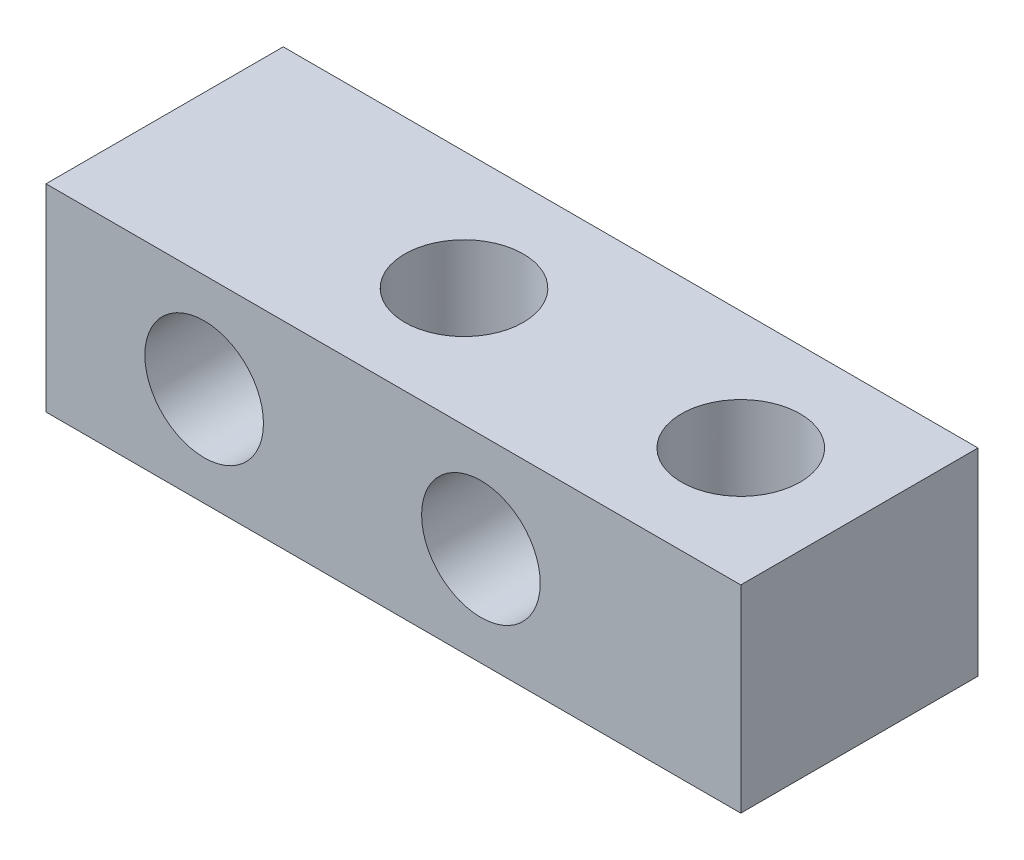
ISO-10303-21;
HEADER;
FILE_DESCRIPTION(('STEP AP214'),'2;1');
FILE_NAME('part.step','',(''),(''),'','','');
FILE_SCHEMA(('AUTOMOTIVE_DESIGN { 1 0 10303 214 1 1 1 1 }'));
ENDSEC;
DATA;
#1=APPLICATION_CONTEXT('core data for automotive mechanical design processes');
#2=APPLICATION_PROTOCOL_DEFINITION('international standard','automotive_design',2000,#1);
#3=PRODUCT_CONTEXT('',#1,'mechanical');
#4=PRODUCT('Part','Part','',(#3));
#5=PRODUCT_RELATED_PRODUCT_CATEGORY('part','',(#4));
#6=PRODUCT_DEFINITION_FORMATION('','',#4);
#7=PRODUCT_DEFINITION_CONTEXT('part definition',#1,'design');
#8=PRODUCT_DEFINITION('design','',#6,#7);
#9=PRODUCT_DEFINITION_SHAPE('','',#8);
#10=(LENGTH_UNIT() NAMED_UNIT(*) SI_UNIT(.MILLI.,.METRE.));
#11=(NAMED_UNIT(*) PLANE_ANGLE_UNIT() SI_UNIT($,.RADIAN.));
#12=(NAMED_UNIT(*) SI_UNIT($,.STERADIAN.) SOLID_ANGLE_UNIT());
#13=UNCERTAINTY_MEASURE_WITH_UNIT(LENGTH_MEASURE(1.E-05),#10,'distance_accuracy_value','');
#14=(GEOMETRIC_REPRESENTATION_CONTEXT(3) GLOBAL_UNCERTAINTY_ASSIGNED_CONTEXT((#13)) GLOBAL_UNIT_ASSIGNED_CONTEXT((#10,
#11,#12)) REPRESENTATION_CONTEXT('',''));
#15=CARTESIAN_POINT('',(0.,0.,0.));
#16=DIRECTION('',(0.,0.,1.));
#17=DIRECTION('',(1.,0.,0.));
#18=AXIS2_PLACEMENT_3D('',#15,#16,#17);
#19=CARTESIAN_POINT('',(-48.5441558772987,4.45000000005311,6.));
#20=DIRECTION('',(0.,-1.,0.));
#21=DIRECTION('',(0.,0.,-1.));
#22=AXIS2_PLACEMENT_3D('',#19,#20,#21);
#23=PLANE('',#22);
#24=CARTESIAN_POINT('',(-40.9713456484612,4.45000000005311,3.));
#25=DIRECTION('',(0.,-1.,0.));
#26=DIRECTION('',(1.,0.,0.));
#27=AXIS2_PLACEMENT_3D('',#24,#25,#26);
#28=CIRCLE('',#27,1.5);
#29=CARTESIAN_POINT('',(-39.4713456484612,4.45000000005311,3.));
#30=VERTEX_POINT('',#29);
#31=EDGE_CURVE('E117',#30,#30,#28,.T.);
#32=ORIENTED_EDGE('',*,*,#31,.T.);
#33=EDGE_LOOP('',(#32));
#34=FACE_BOUND('',#33,.T.);
#35=CARTESIAN_POINT('',(-33.9713456484612,4.45000000005311,3.));
#36=DIRECTION('',(0.,-1.,0.));
#37=DIRECTION('',(1.,0.,0.));
#38=AXIS2_PLACEMENT_3D('',#35,#36,#37);
#39=CIRCLE('',#38,1.5);
#40=CARTESIAN_POINT('',(-32.4713456484612,4.45000000005311,3.));
#41=VERTEX_POINT('',#40);
#42=EDGE_CURVE('E123',#41,#41,#39,.T.);
#43=ORIENTED_EDGE('',*,*,#42,.T.);
#44=EDGE_LOOP('',(#43));
#45=FACE_BOUND('',#44,.T.);
#46=DIRECTION('',(-1.,0.,0.));
#47=VECTOR('',#46,1.);
#48=CARTESIAN_POINT('',(-48.5441558772987,4.45000000005311,0.));
#49=LINE('',#48,#47);
#50=CARTESIAN_POINT('',(-30.9713456484612,4.45000000005311,0.));
#51=VERTEX_POINT('',#50);
#52=CARTESIAN_POINT('',(-48.5441558772987,4.45000000005311,0.));
#53=VERTEX_POINT('',#52);
#54=EDGE_CURVE('E107',#51,#53,#49,.T.);
#55=ORIENTED_EDGE('',*,*,#54,.T.);
#56=DIRECTION('',(0.,0.,-1.));
#57=VECTOR('',#56,1.);
#58=CARTESIAN_POINT('',(-48.5441558772987,4.45000000005311,6.));
#59=LINE('',#58,#57);
#60=CARTESIAN_POINT('',(-48.5441558772987,4.45000000005311,6.));
#61=VERTEX_POINT('',#60);
#62=EDGE_CURVE('E11',#61,#53,#59,.T.);
#63=ORIENTED_EDGE('',*,*,#62,.F.);
#64=DIRECTION('',(-1.,0.,0.));
#65=VECTOR('',#64,1.);
#66=CARTESIAN_POINT('',(-48.5441558772987,4.45000000005311,6.));
#67=LINE('',#66,#65);
#68=CARTESIAN_POINT('',(-30.9713456484612,4.45000000005311,6.));
#69=VERTEX_POINT('',#68);
#70=EDGE_CURVE('E94',#69,#61,#67,.T.);
#71=ORIENTED_EDGE('',*,*,#70,.F.);
#72=DIRECTION('',(0.,0.,-1.));
#73=VECTOR('',#72,1.);
#74=CARTESIAN_POINT('',(-30.9713456484612,4.45000000005311,6.));
#75=LINE('',#74,#73);
#76=EDGE_CURVE('E103',#69,#51,#75,.T.);
#77=ORIENTED_EDGE('',*,*,#76,.T.);
#78=EDGE_LOOP('',(#55,#63,#71,#77));
#79=FACE_BOUND('',#78,.T.);
#80=ADVANCED_FACE('F41',(#34,#45,#79),#23,.F.);
#81=CARTESIAN_POINT('',(-48.5441558772987,-0.549999999946895,6.));
#82=DIRECTION('',(1.,0.,0.));
#83=DIRECTION('',(0.,0.,-1.));
#84=AXIS2_PLACEMENT_3D('',#81,#82,#83);
#85=PLANE('',#84);
#86=DIRECTION('',(0.,-1.,0.));
#87=VECTOR('',#86,1.);
#88=CARTESIAN_POINT('',(-48.5441558772987,-0.549999999946895,0.));
#89=LINE('',#88,#87);
#90=CARTESIAN_POINT('',(-48.5441558772987,-0.549999999946895,0.));
#91=VERTEX_POINT('',#90);
#92=EDGE_CURVE('E98',#53,#91,#89,.T.);
#93=ORIENTED_EDGE('',*,*,#92,.T.);
#94=DIRECTION('',(0.,0.,-1.));
#95=VECTOR('',#94,1.);
#96=CARTESIAN_POINT('',(-48.5441558772987,-0.549999999946895,6.));
#97=LINE('',#96,#95);
#98=CARTESIAN_POINT('',(-48.5441558772987,-0.549999999946895,6.));
#99=VERTEX_POINT('',#98);
#100=EDGE_CURVE('E50',#99,#91,#97,.T.);
#101=ORIENTED_EDGE('',*,*,#100,.F.);
#102=DIRECTION('',(0.,-1.,0.));
#103=VECTOR('',#102,1.);
#104=CARTESIAN_POINT('',(-48.5441558772987,-0.549999999946895,6.));
#105=LINE('',#104,#103);
#106=EDGE_CURVE('E89',#61,#99,#105,.T.);
#107=ORIENTED_EDGE('',*,*,#106,.F.);
#108=ORIENTED_EDGE('',*,*,#62,.T.);
#109=EDGE_LOOP('',(#93,#101,#107,#108));
#110=FACE_BOUND('',#109,.T.);
#111=ADVANCED_FACE('F97',(#110),#85,.F.);
#112=CARTESIAN_POINT('',(-30.9713456484612,-0.549999999946893,6.));
#113=DIRECTION('',(0.,1.,0.));
#114=DIRECTION('',(-1.,0.,0.));
#115=AXIS2_PLACEMENT_3D('',#112,#113,#114);
#116=PLANE('',#115);
#117=CARTESIAN_POINT('',(-40.9713456484612,-0.549999999946894,3.));
#118=DIRECTION('',(0.,1.,0.));
#119=DIRECTION('',(-1.,0.,0.));
#120=AXIS2_PLACEMENT_3D('',#117,#118,#119);
#121=CIRCLE('',#120,1.5);
#122=CARTESIAN_POINT('',(-42.4713456484612,-0.549999999946894,3.));
#123=VERTEX_POINT('',#122);
#124=EDGE_CURVE('E44',#123,#123,#121,.T.);
#125=ORIENTED_EDGE('',*,*,#124,.T.);
#126=EDGE_LOOP('',(#125));
#127=FACE_BOUND('',#126,.T.);
#128=CARTESIAN_POINT('',(-33.9713456484612,-0.549999999946893,3.));
#129=DIRECTION('',(0.,1.,0.));
#130=DIRECTION('',(-1.,0.,0.));
#131=AXIS2_PLACEMENT_3D('',#128,#129,#130);
#132=CIRCLE('',#131,1.5);
#133=CARTESIAN_POINT('',(-35.4713456484612,-0.549999999946893,3.));
#134=VERTEX_POINT('',#133);
#135=EDGE_CURVE('E115',#134,#134,#132,.T.);
#136=ORIENTED_EDGE('',*,*,#135,.T.);
#137=EDGE_LOOP('',(#136));
#138=FACE_BOUND('',#137,.T.);
#139=DIRECTION('',(1.,0.,0.));
#140=VECTOR('',#139,1.);
#141=CARTESIAN_POINT('',(-30.9713456484612,-0.549999999946893,0.));
#142=LINE('',#141,#140);
#143=CARTESIAN_POINT('',(-30.9713456484612,-0.549999999946893,0.));
#144=VERTEX_POINT('',#143);
#145=EDGE_CURVE('E76',#91,#144,#142,.T.);
#146=ORIENTED_EDGE('',*,*,#145,.T.);
#147=DIRECTION('',(0.,0.,-1.));
#148=VECTOR('',#147,1.);
#149=CARTESIAN_POINT('',(-30.9713456484612,-0.549999999946893,6.));
#150=LINE('',#149,#148);
#151=CARTESIAN_POINT('',(-30.9713456484612,-0.549999999946893,6.));
#152=VERTEX_POINT('',#151);
#153=EDGE_CURVE('E99',#152,#144,#150,.T.);
#154=ORIENTED_EDGE('',*,*,#153,.F.);
#155=DIRECTION('',(1.,0.,0.));
#156=VECTOR('',#155,1.);
#157=CARTESIAN_POINT('',(-30.9713456484612,-0.549999999946893,6.));
#158=LINE('',#157,#156);
#159=EDGE_CURVE('E92',#99,#152,#158,.T.);
#160=ORIENTED_EDGE('',*,*,#159,.F.);
#161=ORIENTED_EDGE('',*,*,#100,.T.);
#162=EDGE_LOOP('',(#146,#154,#160,#161));
#163=FACE_BOUND('',#162,.T.);
#164=ADVANCED_FACE('F101',(#127,#138,#163),#116,.F.);
#165=CARTESIAN_POINT('',(-30.9713456484612,4.45000000005311,6.));
#166=DIRECTION('',(-1.,0.,0.));
#167=DIRECTION('',(0.,0.,1.));
#168=AXIS2_PLACEMENT_3D('',#165,#166,#167);
#169=PLANE('',#168);
#170=DIRECTION('',(0.,1.,0.));
#171=VECTOR('',#170,1.);
#172=CARTESIAN_POINT('',(-30.9713456484612,4.45000000005311,0.));
#173=LINE('',#172,#171);
#174=EDGE_CURVE('E82',#144,#51,#173,.T.);
#175=ORIENTED_EDGE('',*,*,#174,.T.);
#176=ORIENTED_EDGE('',*,*,#76,.F.);
#177=DIRECTION('',(0.,1.,0.));
#178=VECTOR('',#177,1.);
#179=CARTESIAN_POINT('',(-30.9713456484612,4.45000000005311,6.));
#180=LINE('',#179,#178);
#181=EDGE_CURVE('E59',#152,#69,#180,.T.);
#182=ORIENTED_EDGE('',*,*,#181,.F.);
#183=ORIENTED_EDGE('',*,*,#153,.T.);
#184=EDGE_LOOP('',(#175,#176,#182,#183));
#185=FACE_BOUND('',#184,.T.);
#186=ADVANCED_FACE('F176',(#185),#169,.F.);
#187=CARTESIAN_POINT('',(0.,0.,6.));
#188=DIRECTION('',(0.,0.,-1.));
#189=DIRECTION('',(-1.,0.,0.));
#190=AXIS2_PLACEMENT_3D('',#187,#188,#189);
#191=PLANE('',#190);
#192=CARTESIAN_POINT('',(-37.544155877299,1.95000000005311,6.));
#193=DIRECTION('',(0.,0.,-1.));
#194=DIRECTION('',(-1.,0.,0.));
#195=AXIS2_PLACEMENT_3D('',#192,#193,#194);
#196=CIRCLE('',#195,1.49999999999939);
#197=CARTESIAN_POINT('',(-39.0441558772984,1.95000000005311,6.));
#198=VERTEX_POINT('',#197);
#199=EDGE_CURVE('E110',#198,#198,#196,.T.);
#200=ORIENTED_EDGE('',*,*,#199,.T.);
#201=EDGE_LOOP('',(#200));
#202=FACE_BOUND('',#201,.T.);
#203=CARTESIAN_POINT('',(-44.544155877299,1.95000000005311,6.));
#204=DIRECTION('',(0.,0.,-1.));
#205=DIRECTION('',(-1.,0.,0.));
#206=AXIS2_PLACEMENT_3D('',#203,#204,#205);
#207=CIRCLE('',#206,1.49999999999939);
#208=CARTESIAN_POINT('',(-46.0441558772984,1.95000000005311,6.));
#209=VERTEX_POINT('',#208);
#210=EDGE_CURVE('E133',#209,#209,#207,.T.);
#211=ORIENTED_EDGE('',*,*,#210,.T.);
#212=EDGE_LOOP('',(#211));
#213=FACE_BOUND('',#212,.T.);
#214=ORIENTED_EDGE('',*,*,#70,.T.);
#215=ORIENTED_EDGE('',*,*,#106,.T.);
#216=ORIENTED_EDGE('',*,*,#159,.T.);
#217=ORIENTED_EDGE('',*,*,#181,.T.);
#218=EDGE_LOOP('',(#214,#215,#216,#217));
#219=FACE_BOUND('',#218,.T.);
#220=ADVANCED_FACE('F90',(#202,#213,#219),#191,.F.);
#221=CARTESIAN_POINT('',(0.,0.,0.));
#222=DIRECTION('',(0.,0.,-1.));
#223=DIRECTION('',(-1.,0.,0.));
#224=AXIS2_PLACEMENT_3D('',#221,#222,#223);
#225=PLANE('',#224);
#226=CARTESIAN_POINT('',(-37.544155877299,1.95000000005311,0.));
#227=DIRECTION('',(0.,0.,1.));
#228=DIRECTION('',(1.,0.,0.));
#229=AXIS2_PLACEMENT_3D('',#226,#227,#228);
#230=CIRCLE('',#229,1.49999999999939);
#231=CARTESIAN_POINT('',(-36.0441558772996,1.95000000005311,0.));
#232=VERTEX_POINT('',#231);
#233=EDGE_CURVE('E130',#232,#232,#230,.T.);
#234=ORIENTED_EDGE('',*,*,#233,.T.);
#235=EDGE_LOOP('',(#234));
#236=FACE_BOUND('',#235,.T.);
#237=CARTESIAN_POINT('',(-44.544155877299,1.95000000005311,0.));
#238=DIRECTION('',(0.,0.,1.));
#239=DIRECTION('',(1.,0.,0.));
#240=AXIS2_PLACEMENT_3D('',#237,#238,#239);
#241=CIRCLE('',#240,1.49999999999939);
#242=CARTESIAN_POINT('',(-43.0441558772997,1.95000000005311,0.));
#243=VERTEX_POINT('',#242);
#244=EDGE_CURVE('E121',#243,#243,#241,.T.);
#245=ORIENTED_EDGE('',*,*,#244,.T.);
#246=EDGE_LOOP('',(#245));
#247=FACE_BOUND('',#246,.T.);
#248=ORIENTED_EDGE('',*,*,#54,.F.);
#249=ORIENTED_EDGE('',*,*,#174,.F.);
#250=ORIENTED_EDGE('',*,*,#145,.F.);
#251=ORIENTED_EDGE('',*,*,#92,.F.);
#252=EDGE_LOOP('',(#248,#249,#250,#251));
#253=FACE_BOUND('',#252,.T.);
#254=ADVANCED_FACE('F157',(#236,#247,#253),#225,.T.);
#255=CARTESIAN_POINT('',(-44.544155877299,1.95000000005311,0.));
#256=DIRECTION('',(0.,0.,1.));
#257=DIRECTION('',(1.,0.,0.));
#258=AXIS2_PLACEMENT_3D('',#255,#256,#257);
#259=CYLINDRICAL_SURFACE('',#258,1.49999999999939);
#260=ORIENTED_EDGE('',*,*,#244,.F.);
#261=EDGE_LOOP('',(#260));
#262=FACE_BOUND('',#261,.T.);
#263=ORIENTED_EDGE('',*,*,#210,.F.);
#264=EDGE_LOOP('',(#263));
#265=FACE_BOUND('',#264,.T.);
#266=ADVANCED_FACE('F146',(#262,#265),#259,.F.);
#267=CARTESIAN_POINT('',(-37.544155877299,1.95000000005311,0.));
#268=DIRECTION('',(0.,0.,1.));
#269=DIRECTION('',(1.,0.,0.));
#270=AXIS2_PLACEMENT_3D('',#267,#268,#269);
#271=CYLINDRICAL_SURFACE('',#270,1.49999999999939);
#272=ORIENTED_EDGE('',*,*,#233,.F.);
#273=EDGE_LOOP('',(#272));
#274=FACE_BOUND('',#273,.T.);
#275=ORIENTED_EDGE('',*,*,#199,.F.);
#276=EDGE_LOOP('',(#275));
#277=FACE_BOUND('',#276,.T.);
#278=ADVANCED_FACE('F143',(#274,#277),#271,.F.);
#279=CARTESIAN_POINT('',(-33.9713456484612,4.45000000005311,3.));
#280=DIRECTION('',(0.,-1.,0.));
#281=DIRECTION('',(1.,0.,0.));
#282=AXIS2_PLACEMENT_3D('',#279,#280,#281);
#283=CYLINDRICAL_SURFACE('',#282,1.5);
#284=ORIENTED_EDGE('',*,*,#42,.F.);
#285=EDGE_LOOP('',(#284));
#286=FACE_BOUND('',#285,.T.);
#287=ORIENTED_EDGE('',*,*,#135,.F.);
#288=EDGE_LOOP('',(#287));
#289=FACE_BOUND('',#288,.T.);
#290=ADVANCED_FACE('F145',(#286,#289),#283,.F.);
#291=CARTESIAN_POINT('',(-40.9713456484612,4.45000000005311,3.));
#292=DIRECTION('',(0.,-1.,0.));
#293=DIRECTION('',(1.,0.,0.));
#294=AXIS2_PLACEMENT_3D('',#291,#292,#293);
#295=CYLINDRICAL_SURFACE('',#294,1.5);
#296=ORIENTED_EDGE('',*,*,#31,.F.);
#297=EDGE_LOOP('',(#296));
#298=FACE_BOUND('',#297,.T.);
#299=ORIENTED_EDGE('',*,*,#124,.F.);
#300=EDGE_LOOP('',(#299));
#301=FACE_BOUND('',#300,.T.);
#302=ADVANCED_FACE('F154',(#298,#301),#295,.F.);
#303=CLOSED_SHELL('',(#80,#111,#164,#186,#220,#254,#266,#278,#290,#302));
#304=MANIFOLD_SOLID_BREP('B2',#303);
#305=ADVANCED_BREP_SHAPE_REPRESENTATION('',(#18,#304),#14);
#306=SHAPE_DEFINITION_REPRESENTATION(#9,#305);
ENDSEC;
END-ISO-10303-21;
